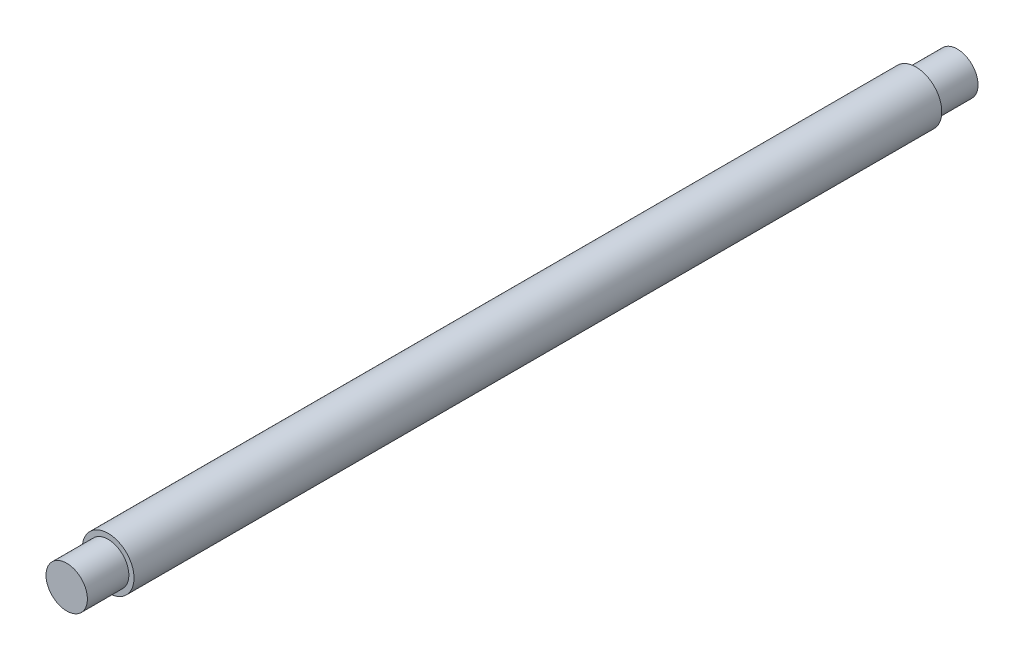
ISO-10303-21;
HEADER;
FILE_DESCRIPTION(('STEP AP214'),'2;1');
FILE_NAME('part.step','',(''),(''),'','','');
FILE_SCHEMA(('AUTOMOTIVE_DESIGN { 1 0 10303 214 1 1 1 1 }'));
ENDSEC;
DATA;
#1=APPLICATION_CONTEXT('core data for automotive mechanical design processes');
#2=APPLICATION_PROTOCOL_DEFINITION('international standard','automotive_design',2000,#1);
#3=PRODUCT_CONTEXT('',#1,'mechanical');
#4=PRODUCT('Part','Part','',(#3));
#5=PRODUCT_RELATED_PRODUCT_CATEGORY('part','',(#4));
#6=PRODUCT_DEFINITION_FORMATION('','',#4);
#7=PRODUCT_DEFINITION_CONTEXT('part definition',#1,'design');
#8=PRODUCT_DEFINITION('design','',#6,#7);
#9=PRODUCT_DEFINITION_SHAPE('','',#8);
#10=(LENGTH_UNIT() NAMED_UNIT(*) SI_UNIT(.MILLI.,.METRE.));
#11=(NAMED_UNIT(*) PLANE_ANGLE_UNIT() SI_UNIT($,.RADIAN.));
#12=(NAMED_UNIT(*) SI_UNIT($,.STERADIAN.) SOLID_ANGLE_UNIT());
#13=UNCERTAINTY_MEASURE_WITH_UNIT(LENGTH_MEASURE(1.E-05),#10,'distance_accuracy_value','');
#14=(GEOMETRIC_REPRESENTATION_CONTEXT(3) GLOBAL_UNCERTAINTY_ASSIGNED_CONTEXT((#13)) GLOBAL_UNIT_ASSIGNED_CONTEXT((#10,
#11,#12)) REPRESENTATION_CONTEXT('',''));
#15=CARTESIAN_POINT('',(0.,0.,0.));
#16=DIRECTION('',(0.,0.,1.));
#17=DIRECTION('',(1.,0.,0.));
#18=AXIS2_PLACEMENT_3D('',#15,#16,#17);
#19=CARTESIAN_POINT('',(0.,0.,172.));
#20=DIRECTION('',(0.,0.,-1.));
#21=DIRECTION('',(-1.,0.,0.));
#22=AXIS2_PLACEMENT_3D('',#19,#20,#21);
#23=CYLINDRICAL_SURFACE('',#22,5.);
#24=CARTESIAN_POINT('',(0.,0.,8.));
#25=DIRECTION('',(0.,0.,-1.));
#26=DIRECTION('',(-1.,0.,0.));
#27=AXIS2_PLACEMENT_3D('',#24,#25,#26);
#28=CIRCLE('',#27,5.);
#29=CARTESIAN_POINT('',(-5.,0.,8.));
#30=VERTEX_POINT('',#29);
#31=EDGE_CURVE('E10',#30,#30,#28,.T.);
#32=ORIENTED_EDGE('',*,*,#31,.F.);
#33=EDGE_LOOP('',(#32));
#34=FACE_BOUND('',#33,.T.);
#35=CARTESIAN_POINT('',(0.,0.,164.));
#36=DIRECTION('',(0.,0.,-1.));
#37=DIRECTION('',(-1.,0.,0.));
#38=AXIS2_PLACEMENT_3D('',#35,#36,#37);
#39=CIRCLE('',#38,5.);
#40=CARTESIAN_POINT('',(-5.,0.,164.));
#41=VERTEX_POINT('',#40);
#42=EDGE_CURVE('E55',#41,#41,#39,.T.);
#43=ORIENTED_EDGE('',*,*,#42,.T.);
#44=EDGE_LOOP('',(#43));
#45=FACE_BOUND('',#44,.T.);
#46=ADVANCED_FACE('F37',(#34,#45),#23,.T.);
#47=CARTESIAN_POINT('',(0.,0.,8.));
#48=DIRECTION('',(0.,0.,-1.));
#49=DIRECTION('',(-1.,0.,0.));
#50=AXIS2_PLACEMENT_3D('',#47,#48,#49);
#51=PLANE('',#50);
#52=CARTESIAN_POINT('',(0.,0.,8.));
#53=DIRECTION('',(0.,0.,-1.));
#54=DIRECTION('',(-1.,0.,0.));
#55=AXIS2_PLACEMENT_3D('',#52,#53,#54);
#56=CIRCLE('',#55,4.);
#57=CARTESIAN_POINT('',(-4.,0.,8.));
#58=VERTEX_POINT('',#57);
#59=EDGE_CURVE('E44',#58,#58,#56,.T.);
#60=ORIENTED_EDGE('',*,*,#59,.F.);
#61=EDGE_LOOP('',(#60));
#62=FACE_BOUND('',#61,.T.);
#63=ORIENTED_EDGE('',*,*,#31,.T.);
#64=EDGE_LOOP('',(#63));
#65=FACE_BOUND('',#64,.T.);
#66=ADVANCED_FACE('F84',(#62,#65),#51,.T.);
#67=CARTESIAN_POINT('',(0.,0.,8.));
#68=DIRECTION('',(0.,0.,-1.));
#69=DIRECTION('',(-1.,0.,0.));
#70=AXIS2_PLACEMENT_3D('',#67,#68,#69);
#71=CYLINDRICAL_SURFACE('',#70,4.);
#72=ORIENTED_EDGE('',*,*,#59,.T.);
#73=EDGE_LOOP('',(#72));
#74=FACE_BOUND('',#73,.T.);
#75=CARTESIAN_POINT('',(0.,0.,0.));
#76=DIRECTION('',(0.,0.,-1.));
#77=DIRECTION('',(-1.,0.,0.));
#78=AXIS2_PLACEMENT_3D('',#75,#76,#77);
#79=CIRCLE('',#78,4.);
#80=CARTESIAN_POINT('',(-4.,0.,0.));
#81=VERTEX_POINT('',#80);
#82=EDGE_CURVE('E49',#81,#81,#79,.T.);
#83=ORIENTED_EDGE('',*,*,#82,.F.);
#84=EDGE_LOOP('',(#83));
#85=FACE_BOUND('',#84,.T.);
#86=ADVANCED_FACE('F89',(#74,#85),#71,.T.);
#87=CARTESIAN_POINT('',(0.,0.,0.));
#88=DIRECTION('',(0.,0.,1.));
#89=DIRECTION('',(1.,0.,0.));
#90=AXIS2_PLACEMENT_3D('',#87,#88,#89);
#91=PLANE('',#90);
#92=ORIENTED_EDGE('',*,*,#82,.T.);
#93=EDGE_LOOP('',(#92));
#94=FACE_BOUND('',#93,.T.);
#95=ADVANCED_FACE('F95',(#94),#91,.F.);
#96=CARTESIAN_POINT('',(0.,0.,164.));
#97=DIRECTION('',(0.,0.,1.));
#98=DIRECTION('',(-1.,0.,0.));
#99=AXIS2_PLACEMENT_3D('',#96,#97,#98);
#100=PLANE('',#99);
#101=ORIENTED_EDGE('',*,*,#42,.F.);
#102=EDGE_LOOP('',(#101));
#103=FACE_BOUND('',#102,.T.);
#104=CARTESIAN_POINT('',(0.,0.,164.));
#105=DIRECTION('',(0.,0.,-1.));
#106=DIRECTION('',(-1.,0.,0.));
#107=AXIS2_PLACEMENT_3D('',#104,#105,#106);
#108=CIRCLE('',#107,4.);
#109=CARTESIAN_POINT('',(-4.,0.,164.));
#110=VERTEX_POINT('',#109);
#111=EDGE_CURVE('E60',#110,#110,#108,.T.);
#112=ORIENTED_EDGE('',*,*,#111,.T.);
#113=EDGE_LOOP('',(#112));
#114=FACE_BOUND('',#113,.T.);
#115=ADVANCED_FACE('F69',(#103,#114),#100,.T.);
#116=CARTESIAN_POINT('',(0.,0.,164.));
#117=DIRECTION('',(0.,0.,1.));
#118=DIRECTION('',(1.,0.,0.));
#119=AXIS2_PLACEMENT_3D('',#116,#117,#118);
#120=CYLINDRICAL_SURFACE('',#119,4.);
#121=ORIENTED_EDGE('',*,*,#111,.F.);
#122=EDGE_LOOP('',(#121));
#123=FACE_BOUND('',#122,.T.);
#124=CARTESIAN_POINT('',(0.,0.,172.));
#125=DIRECTION('',(0.,0.,-1.));
#126=DIRECTION('',(-1.,0.,0.));
#127=AXIS2_PLACEMENT_3D('',#124,#125,#126);
#128=CIRCLE('',#127,4.);
#129=CARTESIAN_POINT('',(-4.,0.,172.));
#130=VERTEX_POINT('',#129);
#131=EDGE_CURVE('E61',#130,#130,#128,.T.);
#132=ORIENTED_EDGE('',*,*,#131,.T.);
#133=EDGE_LOOP('',(#132));
#134=FACE_BOUND('',#133,.T.);
#135=ADVANCED_FACE('F71',(#123,#134),#120,.T.);
#136=CARTESIAN_POINT('',(0.,0.,172.));
#137=DIRECTION('',(0.,0.,1.));
#138=DIRECTION('',(1.,0.,0.));
#139=AXIS2_PLACEMENT_3D('',#136,#137,#138);
#140=PLANE('',#139);
#141=ORIENTED_EDGE('',*,*,#131,.F.);
#142=EDGE_LOOP('',(#141));
#143=FACE_BOUND('',#142,.T.);
#144=ADVANCED_FACE('F74',(#143),#140,.T.);
#145=CLOSED_SHELL('',(#46,#66,#86,#95,#115,#135,#144));
#146=MANIFOLD_SOLID_BREP('B2',#145);
#147=ADVANCED_BREP_SHAPE_REPRESENTATION('',(#18,#146),#14);
#148=SHAPE_DEFINITION_REPRESENTATION(#9,#147);
ENDSEC;
END-ISO-10303-21;
